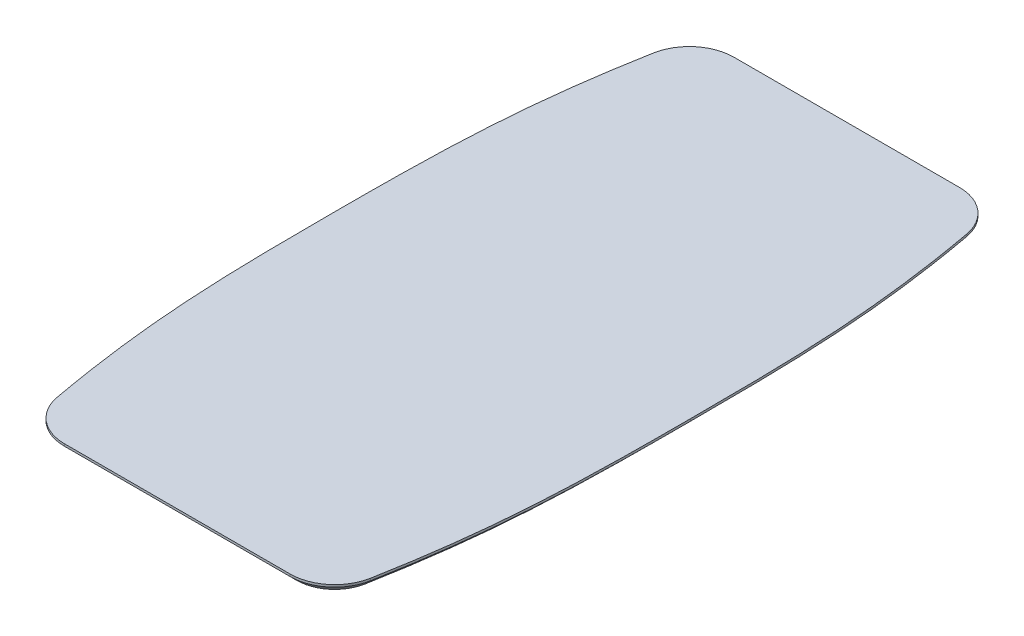
ISO-10303-21;
HEADER;
FILE_DESCRIPTION(('STEP AP214'),'2;1');
FILE_NAME('part.step','',(''),(''),'','','');
FILE_SCHEMA(('AUTOMOTIVE_DESIGN { 1 0 10303 214 1 1 1 1 }'));
ENDSEC;
DATA;
#1=APPLICATION_CONTEXT('core data for automotive mechanical design processes');
#2=APPLICATION_PROTOCOL_DEFINITION('international standard','automotive_design',2000,#1);
#3=PRODUCT_CONTEXT('',#1,'mechanical');
#4=PRODUCT('Part','Part','',(#3));
#5=PRODUCT_RELATED_PRODUCT_CATEGORY('part','',(#4));
#6=PRODUCT_DEFINITION_FORMATION('','',#4);
#7=PRODUCT_DEFINITION_CONTEXT('part definition',#1,'design');
#8=PRODUCT_DEFINITION('design','',#6,#7);
#9=PRODUCT_DEFINITION_SHAPE('','',#8);
#10=(LENGTH_UNIT() NAMED_UNIT(*) SI_UNIT(.MILLI.,.METRE.));
#11=(NAMED_UNIT(*) PLANE_ANGLE_UNIT() SI_UNIT($,.RADIAN.));
#12=(NAMED_UNIT(*) SI_UNIT($,.STERADIAN.) SOLID_ANGLE_UNIT());
#13=UNCERTAINTY_MEASURE_WITH_UNIT(LENGTH_MEASURE(1.E-05),#10,'distance_accuracy_value','');
#14=(GEOMETRIC_REPRESENTATION_CONTEXT(3) GLOBAL_UNCERTAINTY_ASSIGNED_CONTEXT((#13)) GLOBAL_UNIT_ASSIGNED_CONTEXT((#10,
#11,#12)) REPRESENTATION_CONTEXT('',''));
#15=CARTESIAN_POINT('',(0.,0.,0.));
#16=DIRECTION('',(0.,0.,1.));
#17=DIRECTION('',(1.,0.,0.));
#18=AXIS2_PLACEMENT_3D('',#15,#16,#17);
#19=CARTESIAN_POINT('',(0.,-46.,0.));
#20=DIRECTION('',(0.,-1.,0.));
#21=DIRECTION('',(0.,0.,-1.));
#22=AXIS2_PLACEMENT_3D('',#19,#20,#21);
#23=PLANE('',#22);
#24=CARTESIAN_POINT('',(-50.5420977277823,-46.,-130.));
#25=DIRECTION('',(0.,-1.,0.));
#26=DIRECTION('',(0.,0.,-1.));
#27=AXIS2_PLACEMENT_3D('',#24,#25,#26);
#28=CIRCLE('',#27,20.);
#29=CARTESIAN_POINT('',(-50.5420977277823,-46.,-150.));
#30=VERTEX_POINT('',#29);
#31=CARTESIAN_POINT('',(-70.2130925848617,-46.,-133.612749829805));
#32=VERTEX_POINT('',#31);
#33=EDGE_CURVE('E35',#30,#32,#28,.F.);
#34=ORIENTED_EDGE('',*,*,#33,.T.);
#35=CARTESIAN_POINT('',(-67.,-46.,-150.));
#36=CARTESIAN_POINT('',(-79.2126887020527,-46.,-91.256062145386));
#37=CARTESIAN_POINT('',(-79.9999999999998,-46.,-53.3333333333333));
#38=CARTESIAN_POINT('',(-80.,-46.,0.));
#39=B_SPLINE_CURVE_WITH_KNOTS('',3,(#35,#36,#37,#38),.UNSPECIFIED.,.F.,.F.,(4,4),(0.,1.),.UNSPECIFIED.);
#40=CARTESIAN_POINT('',(-80.,-46.,0.));
#41=VERTEX_POINT('',#40);
#42=EDGE_CURVE('E630',#32,#41,#39,.T.);
#43=ORIENTED_EDGE('',*,*,#42,.T.);
#44=CARTESIAN_POINT('',(-80.,-46.,0.));
#45=CARTESIAN_POINT('',(-79.9999999999998,-46.,53.3333333333333));
#46=CARTESIAN_POINT('',(-79.2126887020527,-46.,91.256062145386));
#47=CARTESIAN_POINT('',(-67.,-46.,150.));
#48=B_SPLINE_CURVE_WITH_KNOTS('',3,(#44,#45,#46,#47),.UNSPECIFIED.,.F.,.F.,(4,4),(0.,1.),.UNSPECIFIED.);
#49=CARTESIAN_POINT('',(-70.2130925848617,-46.,133.612749829805));
#50=VERTEX_POINT('',#49);
#51=EDGE_CURVE('E646',#41,#50,#48,.T.);
#52=ORIENTED_EDGE('',*,*,#51,.T.);
#53=CARTESIAN_POINT('',(-50.5420977277822,-46.,130.));
#54=DIRECTION('',(0.,-1.,0.));
#55=DIRECTION('',(0.,0.,-1.));
#56=AXIS2_PLACEMENT_3D('',#53,#54,#55);
#57=CIRCLE('',#56,20.);
#58=CARTESIAN_POINT('',(-50.5420977277822,-46.,150.));
#59=VERTEX_POINT('',#58);
#60=EDGE_CURVE('E40',#50,#59,#57,.F.);
#61=ORIENTED_EDGE('',*,*,#60,.T.);
#62=DIRECTION('',(1.,0.,0.));
#63=VECTOR('',#62,1.);
#64=CARTESIAN_POINT('',(-67.,-46.,150.));
#65=LINE('',#64,#63);
#66=CARTESIAN_POINT('',(50.5420977277822,-46.,150.));
#67=VERTEX_POINT('',#66);
#68=EDGE_CURVE('E213',#59,#67,#65,.T.);
#69=ORIENTED_EDGE('',*,*,#68,.T.);
#70=CARTESIAN_POINT('',(50.5420977277822,-46.,130.));
#71=DIRECTION('',(0.,-1.,0.));
#72=DIRECTION('',(0.,0.,-1.));
#73=AXIS2_PLACEMENT_3D('',#70,#71,#72);
#74=CIRCLE('',#73,20.);
#75=CARTESIAN_POINT('',(70.2130925848617,-46.,133.612749829805));
#76=VERTEX_POINT('',#75);
#77=EDGE_CURVE('E11',#67,#76,#74,.F.);
#78=ORIENTED_EDGE('',*,*,#77,.T.);
#79=CARTESIAN_POINT('',(67.,-46.,150.));
#80=CARTESIAN_POINT('',(79.2126887020527,-46.,91.2560621453859));
#81=CARTESIAN_POINT('',(79.9999999999998,-46.,53.3333333333333));
#82=CARTESIAN_POINT('',(80.,-46.,0.));
#83=B_SPLINE_CURVE_WITH_KNOTS('',3,(#79,#80,#81,#82),.UNSPECIFIED.,.F.,.F.,(4,4),(0.,1.),.UNSPECIFIED.);
#84=CARTESIAN_POINT('',(80.,-46.,0.));
#85=VERTEX_POINT('',#84);
#86=EDGE_CURVE('E54',#76,#85,#83,.T.);
#87=ORIENTED_EDGE('',*,*,#86,.T.);
#88=CARTESIAN_POINT('',(80.,-46.,0.));
#89=CARTESIAN_POINT('',(79.9999999999998,-46.,-53.3333333333334));
#90=CARTESIAN_POINT('',(79.2126887020527,-46.,-91.2560621453859));
#91=CARTESIAN_POINT('',(67.,-46.,-150.));
#92=B_SPLINE_CURVE_WITH_KNOTS('',3,(#88,#89,#90,#91),.UNSPECIFIED.,.F.,.F.,(4,4),(0.,1.),.UNSPECIFIED.);
#93=CARTESIAN_POINT('',(70.2130925848617,-46.,-133.612749829805));
#94=VERTEX_POINT('',#93);
#95=EDGE_CURVE('E538',#85,#94,#92,.T.);
#96=ORIENTED_EDGE('',*,*,#95,.T.);
#97=CARTESIAN_POINT('',(50.5420977277822,-46.,-130.));
#98=DIRECTION('',(0.,-1.,0.));
#99=DIRECTION('',(0.,0.,-1.));
#100=AXIS2_PLACEMENT_3D('',#97,#98,#99);
#101=CIRCLE('',#100,20.);
#102=CARTESIAN_POINT('',(50.5420977277822,-46.,-150.));
#103=VERTEX_POINT('',#102);
#104=EDGE_CURVE('E534',#94,#103,#101,.F.);
#105=ORIENTED_EDGE('',*,*,#104,.T.);
#106=DIRECTION('',(-1.,0.,0.));
#107=VECTOR('',#106,1.);
#108=CARTESIAN_POINT('',(-67.,-46.,-150.));
#109=LINE('',#108,#107);
#110=EDGE_CURVE('E531',#103,#30,#109,.T.);
#111=ORIENTED_EDGE('',*,*,#110,.T.);
#112=EDGE_LOOP('',(#34,#43,#52,#61,#69,#78,#87,#96,#105,#111));
#113=FACE_BOUND('',#112,.T.);
#114=ADVANCED_FACE('F32',(#113),#23,.F.);
#115=CARTESIAN_POINT('',(-67.,-50.,-150.));
#116=CARTESIAN_POINT('',(-79.2126887020527,-50.,-91.256062145386));
#117=CARTESIAN_POINT('',(-79.9999999999998,-50.,-53.3333333333333));
#118=CARTESIAN_POINT('',(-80.,-50.,0.));
#119=B_SPLINE_CURVE_WITH_KNOTS('',3,(#115,#116,#117,#118),.UNSPECIFIED.,.F.,.F.,(4,4),(0.,1.),.UNSPECIFIED.);
#120=DIRECTION('',(0.,1.,0.));
#121=VECTOR('',#120,1.);
#122=SURFACE_OF_LINEAR_EXTRUSION('',#119,#121);
#123=ORIENTED_EDGE('',*,*,#42,.F.);
#124=DIRECTION('',(0.,1.,0.));
#125=VECTOR('',#124,1.);
#126=CARTESIAN_POINT('',(-70.2130925848617,0.,-133.612749829805));
#127=LINE('',#126,#125);
#128=CARTESIAN_POINT('',(-70.2130925848617,-47.,-133.612749829805));
#129=VERTEX_POINT('',#128);
#130=EDGE_CURVE('E192',#32,#129,#127,.F.);
#131=ORIENTED_EDGE('',*,*,#130,.T.);
#132=CARTESIAN_POINT('',(-70.2130925848605,-47.,-133.612749829812));
#133=CARTESIAN_POINT('',(-79.3567051959867,-47.,-83.8268623142315));
#134=CARTESIAN_POINT('',(-79.9999999999998,-47.,-48.2092647372321));
#135=CARTESIAN_POINT('',(-80.,-47.,0.));
#136=B_SPLINE_CURVE_WITH_KNOTS('',3,(#132,#133,#134,#135),.UNSPECIFIED.,.F.,.F.,(4,4),
(0.096076286176898,1.),.UNSPECIFIED.);
#137=CARTESIAN_POINT('',(-80.,-46.9999999999923,0.));
#138=VERTEX_POINT('',#137);
#139=EDGE_CURVE('E373',#129,#138,#136,.T.);
#140=ORIENTED_EDGE('',*,*,#139,.T.);
#141=DIRECTION('',(0.,1.,0.));
#142=VECTOR('',#141,1.);
#143=CARTESIAN_POINT('',(-80.,-50.,0.));
#144=LINE('',#143,#142);
#145=EDGE_CURVE('E176',#138,#41,#144,.T.);
#146=ORIENTED_EDGE('',*,*,#145,.T.);
#147=EDGE_LOOP('',(#123,#131,#140,#146));
#148=FACE_BOUND('',#147,.T.);
#149=ADVANCED_FACE('F278',(#148),#122,.T.);
#150=CARTESIAN_POINT('',(-67.,-50.,-150.));
#151=DIRECTION('',(0.,0.,-1.));
#152=DIRECTION('',(-1.,0.,0.));
#153=AXIS2_PLACEMENT_3D('',#150,#151,#152);
#154=PLANE('',#153);
#155=ORIENTED_EDGE('',*,*,#110,.F.);
#156=DIRECTION('',(0.,1.,0.));
#157=VECTOR('',#156,1.);
#158=CARTESIAN_POINT('',(50.5420977277822,-50.,-150.));
#159=LINE('',#158,#157);
#160=CARTESIAN_POINT('',(50.5420977277822,-47.,-150.));
#161=VERTEX_POINT('',#160);
#162=EDGE_CURVE('E219',#103,#161,#159,.F.);
#163=ORIENTED_EDGE('',*,*,#162,.T.);
#164=DIRECTION('',(-1.,0.,0.));
#165=VECTOR('',#164,1.);
#166=CARTESIAN_POINT('',(-50.5420977277823,-47.,-150.));
#167=LINE('',#166,#165);
#168=CARTESIAN_POINT('',(-50.5420977277823,-47.,-150.));
#169=VERTEX_POINT('',#168);
#170=EDGE_CURVE('E357',#161,#169,#167,.T.);
#171=ORIENTED_EDGE('',*,*,#170,.T.);
#172=DIRECTION('',(0.,1.,0.));
#173=VECTOR('',#172,1.);
#174=CARTESIAN_POINT('',(-50.5420977277823,-50.,-150.));
#175=LINE('',#174,#173);
#176=EDGE_CURVE('E212',#169,#30,#175,.T.);
#177=ORIENTED_EDGE('',*,*,#176,.T.);
#178=EDGE_LOOP('',(#155,#163,#171,#177));
#179=FACE_BOUND('',#178,.T.);
#180=ADVANCED_FACE('F307',(#179),#154,.T.);
#181=CARTESIAN_POINT('',(80.,-50.,0.));
#182=CARTESIAN_POINT('',(79.9999999999998,-50.,-53.3333333333334));
#183=CARTESIAN_POINT('',(79.2126887020527,-50.,-91.2560621453859));
#184=CARTESIAN_POINT('',(67.,-50.,-150.));
#185=B_SPLINE_CURVE_WITH_KNOTS('',3,(#181,#182,#183,#184),.UNSPECIFIED.,.F.,.F.,(4,4),(0.,1.),.UNSPECIFIED.);
#186=DIRECTION('',(0.,1.,0.));
#187=VECTOR('',#186,1.);
#188=SURFACE_OF_LINEAR_EXTRUSION('',#185,#187);
#189=ORIENTED_EDGE('',*,*,#95,.F.);
#190=DIRECTION('',(0.,1.,0.));
#191=VECTOR('',#190,1.);
#192=CARTESIAN_POINT('',(80.,-50.,0.));
#193=LINE('',#192,#191);
#194=CARTESIAN_POINT('',(80.,-47.,0.));
#195=VERTEX_POINT('',#194);
#196=EDGE_CURVE('E220',#195,#85,#193,.T.);
#197=ORIENTED_EDGE('',*,*,#196,.F.);
#198=CARTESIAN_POINT('',(80.,-47.,0.));
#199=CARTESIAN_POINT('',(79.9999999999998,-47.,-48.2092647372321));
#200=CARTESIAN_POINT('',(79.3567051959867,-47.,-83.8268623142315));
#201=CARTESIAN_POINT('',(70.2130925848604,-47.,-133.612749829812));
#202=B_SPLINE_CURVE_WITH_KNOTS('',3,(#198,#199,#200,#201),.UNSPECIFIED.,.F.,.F.,(4,4),(0.,
0.903923713823101),.UNSPECIFIED.);
#203=CARTESIAN_POINT('',(70.2130925848617,-47.,-133.612749829805));
#204=VERTEX_POINT('',#203);
#205=EDGE_CURVE('E351',#195,#204,#202,.T.);
#206=ORIENTED_EDGE('',*,*,#205,.T.);
#207=DIRECTION('',(0.,1.,0.));
#208=VECTOR('',#207,1.);
#209=CARTESIAN_POINT('',(70.2130925848617,-50.,-133.612749829805));
#210=LINE('',#209,#208);
#211=EDGE_CURVE('E186',#204,#94,#210,.T.);
#212=ORIENTED_EDGE('',*,*,#211,.T.);
#213=EDGE_LOOP('',(#189,#197,#206,#212));
#214=FACE_BOUND('',#213,.T.);
#215=ADVANCED_FACE('F253',(#214),#188,.T.);
#216=CARTESIAN_POINT('',(67.,-50.,150.));
#217=CARTESIAN_POINT('',(79.2126887020527,-50.,91.2560621453859));
#218=CARTESIAN_POINT('',(79.9999999999998,-50.,53.3333333333333));
#219=CARTESIAN_POINT('',(80.,-50.,0.));
#220=B_SPLINE_CURVE_WITH_KNOTS('',3,(#216,#217,#218,#219),.UNSPECIFIED.,.F.,.F.,(4,4),(0.,1.),.UNSPECIFIED.);
#221=DIRECTION('',(0.,1.,0.));
#222=VECTOR('',#221,1.);
#223=SURFACE_OF_LINEAR_EXTRUSION('',#220,#222);
#224=ORIENTED_EDGE('',*,*,#86,.F.);
#225=DIRECTION('',(0.,1.,0.));
#226=VECTOR('',#225,1.);
#227=CARTESIAN_POINT('',(70.2130925848617,0.,133.612749829805));
#228=LINE('',#227,#226);
#229=CARTESIAN_POINT('',(70.2130925848617,-47.,133.612749829805));
#230=VERTEX_POINT('',#229);
#231=EDGE_CURVE('E179',#76,#230,#228,.F.);
#232=ORIENTED_EDGE('',*,*,#231,.T.);
#233=CARTESIAN_POINT('',(70.2130925848604,-47.,133.612749829812));
#234=CARTESIAN_POINT('',(79.3567051959867,-47.,83.8268623142315));
#235=CARTESIAN_POINT('',(79.9999999999998,-47.,48.2092647372321));
#236=CARTESIAN_POINT('',(80.,-47.,0.));
#237=B_SPLINE_CURVE_WITH_KNOTS('',3,(#233,#234,#235,#236),.UNSPECIFIED.,.F.,.F.,(4,4),
(0.0960762861768977,1.),.UNSPECIFIED.);
#238=EDGE_CURVE('E236',#230,#195,#237,.T.);
#239=ORIENTED_EDGE('',*,*,#238,.T.);
#240=ORIENTED_EDGE('',*,*,#196,.T.);
#241=EDGE_LOOP('',(#224,#232,#239,#240));
#242=FACE_BOUND('',#241,.T.);
#243=ADVANCED_FACE('F242',(#242),#223,.T.);
#244=CARTESIAN_POINT('',(-67.,-50.,150.));
#245=DIRECTION('',(0.,0.,1.));
#246=DIRECTION('',(1.,0.,0.));
#247=AXIS2_PLACEMENT_3D('',#244,#245,#246);
#248=PLANE('',#247);
#249=ORIENTED_EDGE('',*,*,#68,.F.);
#250=DIRECTION('',(0.,1.,0.));
#251=VECTOR('',#250,1.);
#252=CARTESIAN_POINT('',(-50.5420977277822,-50.,150.));
#253=LINE('',#252,#251);
#254=CARTESIAN_POINT('',(-50.5420977277822,-47.,150.));
#255=VERTEX_POINT('',#254);
#256=EDGE_CURVE('E189',#59,#255,#253,.F.);
#257=ORIENTED_EDGE('',*,*,#256,.T.);
#258=DIRECTION('',(1.,0.,0.));
#259=VECTOR('',#258,1.);
#260=CARTESIAN_POINT('',(50.5420977277822,-47.,150.));
#261=LINE('',#260,#259);
#262=CARTESIAN_POINT('',(50.5420977277822,-47.,150.));
#263=VERTEX_POINT('',#262);
#264=EDGE_CURVE('E167',#255,#263,#261,.T.);
#265=ORIENTED_EDGE('',*,*,#264,.T.);
#266=DIRECTION('',(0.,1.,0.));
#267=VECTOR('',#266,1.);
#268=CARTESIAN_POINT('',(50.5420977277822,-50.,150.));
#269=LINE('',#268,#267);
#270=EDGE_CURVE('E185',#263,#67,#269,.T.);
#271=ORIENTED_EDGE('',*,*,#270,.T.);
#272=EDGE_LOOP('',(#249,#257,#265,#271));
#273=FACE_BOUND('',#272,.T.);
#274=ADVANCED_FACE('F252',(#273),#248,.T.);
#275=CARTESIAN_POINT('',(-80.,-50.,0.));
#276=CARTESIAN_POINT('',(-79.9999999999998,-50.,53.3333333333333));
#277=CARTESIAN_POINT('',(-79.2126887020527,-50.,91.256062145386));
#278=CARTESIAN_POINT('',(-67.,-50.,150.));
#279=B_SPLINE_CURVE_WITH_KNOTS('',3,(#275,#276,#277,#278),.UNSPECIFIED.,.F.,.F.,(4,4),(0.,1.),.UNSPECIFIED.);
#280=DIRECTION('',(0.,1.,0.));
#281=VECTOR('',#280,1.);
#282=SURFACE_OF_LINEAR_EXTRUSION('',#279,#281);
#283=ORIENTED_EDGE('',*,*,#51,.F.);
#284=ORIENTED_EDGE('',*,*,#145,.F.);
#285=CARTESIAN_POINT('',(-80.,-47.,0.));
#286=CARTESIAN_POINT('',(-79.9999999999998,-47.,48.2092647372321));
#287=CARTESIAN_POINT('',(-79.3567051959867,-47.,83.8268623142315));
#288=CARTESIAN_POINT('',(-70.2130925848604,-47.,133.612749829812));
#289=B_SPLINE_CURVE_WITH_KNOTS('',3,(#285,#286,#287,#288),.UNSPECIFIED.,.F.,.F.,(4,4),(0.,
0.903923713823101),.UNSPECIFIED.);
#290=CARTESIAN_POINT('',(-70.2130925848617,-47.,133.612749829805));
#291=VERTEX_POINT('',#290);
#292=EDGE_CURVE('E146',#138,#291,#289,.T.);
#293=ORIENTED_EDGE('',*,*,#292,.T.);
#294=DIRECTION('',(0.,1.,0.));
#295=VECTOR('',#294,1.);
#296=CARTESIAN_POINT('',(-70.2130925848617,-50.,133.612749829805));
#297=LINE('',#296,#295);
#298=EDGE_CURVE('E174',#291,#50,#297,.T.);
#299=ORIENTED_EDGE('',*,*,#298,.T.);
#300=EDGE_LOOP('',(#283,#284,#293,#299));
#301=FACE_BOUND('',#300,.T.);
#302=ADVANCED_FACE('F173',(#301),#282,.T.);
#303=CARTESIAN_POINT('',(-78.0797582632697,-50.,-72.9710233045197));
#304=DIRECTION('',(0.,1.,0.));
#305=DIRECTION('',(0.,0.,1.));
#306=AXIS2_PLACEMENT_3D('',#303,#304,#305);
#307=PLANE('',#306);
#308=CARTESIAN_POINT('',(-50.5420977277822,-50.,130.));
#309=DIRECTION('',(0.,1.,0.));
#310=DIRECTION('',(0.,0.,1.));
#311=AXIS2_PLACEMENT_3D('',#308,#309,#310);
#312=CIRCLE('',#311,17.);
#313=CARTESIAN_POINT('',(-50.5420977277822,-50.,147.));
#314=VERTEX_POINT('',#313);
#315=CARTESIAN_POINT('',(-67.2624433562985,-50.,133.070837355341));
#316=VERTEX_POINT('',#315);
#317=EDGE_CURVE('E335',#314,#316,#312,.F.);
#318=ORIENTED_EDGE('',*,*,#317,.T.);
#319=CARTESIAN_POINT('',(-77.,-50.,0.));
#320=CARTESIAN_POINT('',(-76.9999246350399,-50.,5.56972747860356));
#321=CARTESIAN_POINT('',(-76.9917468029326,-50.,11.1393663040661));
#322=CARTESIAN_POINT('',(-76.9271541248784,-50.,22.2781161728625));
#323=CARTESIAN_POINT('',(-76.8706135401708,-50.,27.8473427625315));
#324=CARTESIAN_POINT('',(-76.7207698856601,-50.,36.2001203238439));
#325=CARTESIAN_POINT('',(-76.6599001428068,-50.,38.9843474277254));
#326=CARTESIAN_POINT('',(-76.5113736464877,-50.,44.5525096451225));
#327=CARTESIAN_POINT('',(-76.4236809388062,-50.,47.3363445453702));
#328=CARTESIAN_POINT('',(-76.1133047678833,-50.,55.684240808743));
#329=CARTESIAN_POINT('',(-75.8427648368739,-50.,61.2454692329679));
#330=CARTESIAN_POINT('',(-75.3181974953393,-50.,69.579792178243));
#331=CARTESIAN_POINT('',(-75.1236091511747,-50.,72.356649725108));
#332=CARTESIAN_POINT('',(-74.6924427012141,-50.,77.9077046778532));
#333=CARTESIAN_POINT('',(-74.4558430657217,-50.,80.6819970368138));
#334=CARTESIAN_POINT('',(-73.9391393537637,-50.,86.2274403840528));
#335=CARTESIAN_POINT('',(-73.6589302655495,-50.,88.9995367556694));
#336=CARTESIAN_POINT('',(-73.0549465396082,-50.,94.5366287214407));
#337=CARTESIAN_POINT('',(-72.7311513884567,-50.,97.3020705102008));
#338=CARTESIAN_POINT('',(-72.0405398911324,-50.,102.8267052179));
#339=CARTESIAN_POINT('',(-71.6737334229871,-50.,105.58592038572));
#340=CARTESIAN_POINT('',(-70.898453573566,-50.,111.098338898627));
#341=CARTESIAN_POINT('',(-70.4899987544202,-50.,113.851544921792));
#342=CARTESIAN_POINT('',(-69.2049618991668,-50.,122.102553285674));
#343=CARTESIAN_POINT('',(-68.2687523596724,-50.,127.591752397136));
#344=CARTESIAN_POINT('',(-67.2624433562985,-50.,133.070837355341));
#345=B_SPLINE_CURVE_WITH_KNOTS('',3,(#319,#320,#321,#322,#323,#324,#325,#326,#327,#328,#329,
#330,#331,#332,#333,#334,#335,#336,#337,#338,#339,#340,#341,#342,#343,#344),.UNSPECIFIED.,.F.,
.F.,(4,2,2,2,2,2,2,2,2,2,2,2,4),(0.,0.0166999041855329,0.0333998083710659,0.0417497604638323,
0.0500997125565988,0.0667996167421317,0.0751495688348982,0.0834995209276647,0.0918494730204311,
0.100199425113198,0.108549377205964,0.116899329298731,0.133599233484263),.UNSPECIFIED.);
#346=CARTESIAN_POINT('',(-77.,-50.,0.));
#347=VERTEX_POINT('',#346);
#348=EDGE_CURVE('E149',#316,#347,#345,.F.);
#349=ORIENTED_EDGE('',*,*,#348,.T.);
#350=CARTESIAN_POINT('',(-67.2624433562985,-50.,-133.070837355341));
#351=CARTESIAN_POINT('',(-68.2687504814547,-50.,-127.591762405173));
#352=CARTESIAN_POINT('',(-69.2049697545193,-50.,-122.102512927923));
#353=CARTESIAN_POINT('',(-70.490032217434,-50.,-113.851325016208));
#354=CARTESIAN_POINT('',(-70.8984973737365,-50.,-111.098041795806));
#355=CARTESIAN_POINT('',(-71.6738000467543,-50.,-105.585432345322));
#356=CARTESIAN_POINT('',(-72.0406189938867,-50.,-102.826103419649));
#357=CARTESIAN_POINT('',(-72.731255931787,-50.,-97.3012031968644));
#358=CARTESIAN_POINT('',(-73.0550550990931,-50.,-94.5356971611394));
#359=CARTESIAN_POINT('',(-73.6590813632625,-50.,-88.9980878350079));
#360=CARTESIAN_POINT('',(-73.9392512296184,-50.,-86.2263359587117));
#361=CARTESIAN_POINT('',(-74.7142573012216,-50.,-77.9084133433172));
#362=CARTESIAN_POINT('',(-75.143376394291,-50.,-72.3574088378304));
#363=CARTESIAN_POINT('',(-75.8427831492043,-50.,-61.2451183262079));
#364=CARTESIAN_POINT('',(-76.113322818658,-50.,-55.683880285069));
#365=CARTESIAN_POINT('',(-76.4237034685099,-50.,-47.335676165444));
#366=CARTESIAN_POINT('',(-76.5113968389664,-50.,-44.5517282032462));
#367=CARTESIAN_POINT('',(-76.6599130906574,-50.,-38.9837739985521));
#368=CARTESIAN_POINT('',(-76.7207808428361,-50.,-36.1995717086352));
#369=CARTESIAN_POINT('',(-76.8706184812856,-50.,-27.846943291124));
#370=CARTESIAN_POINT('',(-76.9271565002719,-50.,-22.2778172785591));
#371=CARTESIAN_POINT('',(-76.9917469596549,-50.,-11.1392287268974));
#372=CARTESIAN_POINT('',(-76.99992464515,-50.,-5.56966039801091));
#373=CARTESIAN_POINT('',(-77.,-50.,0.));
#374=B_SPLINE_CURVE_WITH_KNOTS('',3,(#350,#351,#352,#353,#354,#355,#356,#357,#358,#359,#360,
#361,#362,#363,#364,#365,#366,#367,#368,#369,#370,#371,#372,#373),.UNSPECIFIED.,.F.,.F.,(4,2,2,
2,2,2,2,2,2,2,2,4),(0.,0.0167079051064856,0.0250618576597284,0.0334158102129711,
0.0417697627662139,0.0501237153194567,0.0668316204259423,0.0835395255324279,0.0918934780856706,
0.100247430638913,0.116955335745399,0.133663240851885),.UNSPECIFIED.);
#375=CARTESIAN_POINT('',(-67.2624433562985,-50.,-133.070837355341));
#376=VERTEX_POINT('',#375);
#377=EDGE_CURVE('E178',#347,#376,#374,.F.);
#378=ORIENTED_EDGE('',*,*,#377,.T.);
#379=CARTESIAN_POINT('',(-50.5420977277823,-50.,-130.));
#380=DIRECTION('',(0.,1.,0.));
#381=DIRECTION('',(0.,0.,1.));
#382=AXIS2_PLACEMENT_3D('',#379,#380,#381);
#383=CIRCLE('',#382,17.);
#384=CARTESIAN_POINT('',(-50.5420977277823,-50.,-147.));
#385=VERTEX_POINT('',#384);
#386=EDGE_CURVE('E297',#376,#385,#383,.F.);
#387=ORIENTED_EDGE('',*,*,#386,.T.);
#388=DIRECTION('',(1.,0.,0.));
#389=VECTOR('',#388,1.);
#390=CARTESIAN_POINT('',(50.5420977277822,-50.,-147.));
#391=LINE('',#390,#389);
#392=CARTESIAN_POINT('',(50.5420977277822,-50.,-147.));
#393=VERTEX_POINT('',#392);
#394=EDGE_CURVE('E514',#385,#393,#391,.T.);
#395=ORIENTED_EDGE('',*,*,#394,.T.);
#396=CARTESIAN_POINT('',(50.5420977277822,-50.,-130.));
#397=DIRECTION('',(0.,1.,0.));
#398=DIRECTION('',(0.,0.,1.));
#399=AXIS2_PLACEMENT_3D('',#396,#397,#398);
#400=CIRCLE('',#399,17.);
#401=CARTESIAN_POINT('',(67.2624433562985,-50.,-133.070837355341));
#402=VERTEX_POINT('',#401);
#403=EDGE_CURVE('E513',#393,#402,#400,.F.);
#404=ORIENTED_EDGE('',*,*,#403,.T.);
#405=CARTESIAN_POINT('',(77.,-50.,0.));
#406=CARTESIAN_POINT('',(76.99992463504,-50.,-5.56972747860355));
#407=CARTESIAN_POINT('',(76.9917468029325,-50.,-11.1393663040662));
#408=CARTESIAN_POINT('',(76.9271541248784,-50.,-22.2781161728625));
#409=CARTESIAN_POINT('',(76.8706135401709,-50.,-27.8473427625315));
#410=CARTESIAN_POINT('',(76.7207698856601,-50.,-36.2001203238439));
#411=CARTESIAN_POINT('',(76.6599001428069,-50.,-38.9843474277254));
#412=CARTESIAN_POINT('',(76.5113736464877,-50.,-44.5525096451225));
#413=CARTESIAN_POINT('',(76.4236809388062,-50.,-47.3363445453702));
#414=CARTESIAN_POINT('',(76.1133047678832,-50.,-55.6842408087429));
#415=CARTESIAN_POINT('',(75.842764836874,-50.,-61.2454692329678));
#416=CARTESIAN_POINT('',(75.3181974953393,-50.,-69.579792178243));
#417=CARTESIAN_POINT('',(75.1236091511748,-50.,-72.356649725108));
#418=CARTESIAN_POINT('',(74.6924427012141,-50.,-77.9077046778533));
#419=CARTESIAN_POINT('',(74.4558430657217,-50.,-80.6819970368138));
#420=CARTESIAN_POINT('',(73.9391393537637,-50.,-86.2274403840528));
#421=CARTESIAN_POINT('',(73.6589302655495,-50.,-88.9995367556694));
#422=CARTESIAN_POINT('',(73.0549465396082,-50.,-94.5366287214407));
#423=CARTESIAN_POINT('',(72.7311513884567,-50.,-97.3020705102008));
#424=CARTESIAN_POINT('',(72.0405398911324,-50.,-102.8267052179));
#425=CARTESIAN_POINT('',(71.6737334229871,-50.,-105.58592038572));
#426=CARTESIAN_POINT('',(70.898453573566,-50.,-111.098338898627));
#427=CARTESIAN_POINT('',(70.4899987544202,-50.,-113.851544921792));
#428=CARTESIAN_POINT('',(69.2049618991668,-50.,-122.102553285674));
#429=CARTESIAN_POINT('',(68.2687523596724,-50.,-127.591752397136));
#430=CARTESIAN_POINT('',(67.2624433562985,-50.,-133.070837355341));
#431=B_SPLINE_CURVE_WITH_KNOTS('',3,(#405,#406,#407,#408,#409,#410,#411,#412,#413,#414,#415,
#416,#417,#418,#419,#420,#421,#422,#423,#424,#425,#426,#427,#428,#429,#430),.UNSPECIFIED.,.F.,
.F.,(4,2,2,2,2,2,2,2,2,2,2,2,4),(0.,0.0166999041855329,0.0333998083710659,0.0417497604638323,
0.0500997125565988,0.0667996167421317,0.0751495688348982,0.0834995209276647,0.0918494730204311,
0.100199425113198,0.108549377205964,0.116899329298731,0.133599233484263),.UNSPECIFIED.);
#432=CARTESIAN_POINT('',(77.,-50.,0.));
#433=VERTEX_POINT('',#432);
#434=EDGE_CURVE('E512',#402,#433,#431,.F.);
#435=ORIENTED_EDGE('',*,*,#434,.T.);
#436=CARTESIAN_POINT('',(67.2624433562985,-50.,133.070837355341));
#437=CARTESIAN_POINT('',(68.2687504814547,-50.,127.591762405173));
#438=CARTESIAN_POINT('',(69.2049697545193,-50.,122.102512927923));
#439=CARTESIAN_POINT('',(70.490032217434,-50.,113.851325016208));
#440=CARTESIAN_POINT('',(70.8984973737364,-50.,111.098041795806));
#441=CARTESIAN_POINT('',(71.6738000467543,-50.,105.585432345322));
#442=CARTESIAN_POINT('',(72.0406189938867,-50.,102.826103419649));
#443=CARTESIAN_POINT('',(72.7312559317871,-50.,97.3012031968645));
#444=CARTESIAN_POINT('',(73.0550550990932,-50.,94.5356971611395));
#445=CARTESIAN_POINT('',(73.6590813632624,-50.,88.998087835008));
#446=CARTESIAN_POINT('',(73.9392512296184,-50.,86.2263359587118));
#447=CARTESIAN_POINT('',(74.7142573012216,-50.,77.9084133433172));
#448=CARTESIAN_POINT('',(75.143376394291,-50.,72.3574088378304));
#449=CARTESIAN_POINT('',(75.8427831492042,-50.,61.245118326208));
#450=CARTESIAN_POINT('',(76.113322818658,-50.,55.6838802850691));
#451=CARTESIAN_POINT('',(76.4237034685099,-50.,47.335676165444));
#452=CARTESIAN_POINT('',(76.5113968389664,-50.,44.5517282032462));
#453=CARTESIAN_POINT('',(76.6599130906573,-50.,38.9837739985521));
#454=CARTESIAN_POINT('',(76.7207808428361,-50.,36.1995717086352));
#455=CARTESIAN_POINT('',(76.8706184812856,-50.,27.846943291124));
#456=CARTESIAN_POINT('',(76.9271565002719,-50.,22.2778172785591));
#457=CARTESIAN_POINT('',(76.9917469596549,-50.,11.1392287268974));
#458=CARTESIAN_POINT('',(76.99992464515,-50.,5.56966039801091));
#459=CARTESIAN_POINT('',(77.,-50.,0.));
#460=B_SPLINE_CURVE_WITH_KNOTS('',3,(#436,#437,#438,#439,#440,#441,#442,#443,#444,#445,#446,
#447,#448,#449,#450,#451,#452,#453,#454,#455,#456,#457,#458,#459),.UNSPECIFIED.,.F.,.F.,(4,2,2,
2,2,2,2,2,2,2,2,4),(0.,0.0167079051064856,0.0250618576597284,0.0334158102129712,
0.0417697627662139,0.0501237153194567,0.0668316204259423,0.0835395255324279,0.0918934780856707,
0.100247430638913,0.116955335745399,0.133663240851885),.UNSPECIFIED.);
#461=CARTESIAN_POINT('',(67.2624433562985,-50.,133.070837355341));
#462=VERTEX_POINT('',#461);
#463=EDGE_CURVE('E331',#433,#462,#460,.F.);
#464=ORIENTED_EDGE('',*,*,#463,.T.);
#465=CARTESIAN_POINT('',(50.5420977277822,-50.,130.));
#466=DIRECTION('',(0.,1.,0.));
#467=DIRECTION('',(0.,0.,1.));
#468=AXIS2_PLACEMENT_3D('',#465,#466,#467);
#469=CIRCLE('',#468,17.);
#470=CARTESIAN_POINT('',(50.5420977277822,-50.,147.));
#471=VERTEX_POINT('',#470);
#472=EDGE_CURVE('E323',#462,#471,#469,.F.);
#473=ORIENTED_EDGE('',*,*,#472,.T.);
#474=DIRECTION('',(-1.,0.,0.));
#475=VECTOR('',#474,1.);
#476=CARTESIAN_POINT('',(-50.5420977277822,-50.,147.));
#477=LINE('',#476,#475);
#478=EDGE_CURVE('E330',#471,#314,#477,.T.);
#479=ORIENTED_EDGE('',*,*,#478,.T.);
#480=EDGE_LOOP('',(#318,#349,#378,#387,#395,#404,#435,#464,#473,#479));
#481=FACE_BOUND('',#480,.T.);
#482=ADVANCED_FACE('F277',(#481),#307,.F.);
#483=CARTESIAN_POINT('',(-50.5420977277823,-25.,-130.));
#484=DIRECTION('',(0.,1.,0.));
#485=DIRECTION('',(0.,0.,1.));
#486=AXIS2_PLACEMENT_3D('',#483,#484,#485);
#487=CYLINDRICAL_SURFACE('',#486,20.);
#488=ORIENTED_EDGE('',*,*,#33,.F.);
#489=ORIENTED_EDGE('',*,*,#176,.F.);
#490=CARTESIAN_POINT('',(-50.5420977277823,-47.,-130.));
#491=DIRECTION('',(0.,1.,0.));
#492=DIRECTION('',(0.,0.,1.));
#493=AXIS2_PLACEMENT_3D('',#490,#491,#492);
#494=CIRCLE('',#493,20.);
#495=EDGE_CURVE('E363',#169,#129,#494,.T.);
#496=ORIENTED_EDGE('',*,*,#495,.T.);
#497=ORIENTED_EDGE('',*,*,#130,.F.);
#498=EDGE_LOOP('',(#488,#489,#496,#497));
#499=FACE_BOUND('',#498,.T.);
#500=ADVANCED_FACE('F306',(#499),#487,.T.);
#501=CARTESIAN_POINT('',(50.5420977277822,-25.,-130.));
#502=DIRECTION('',(0.,1.,0.));
#503=DIRECTION('',(0.,0.,1.));
#504=AXIS2_PLACEMENT_3D('',#501,#502,#503);
#505=CYLINDRICAL_SURFACE('',#504,20.);
#506=ORIENTED_EDGE('',*,*,#104,.F.);
#507=ORIENTED_EDGE('',*,*,#211,.F.);
#508=CARTESIAN_POINT('',(50.5420977277822,-47.,-130.));
#509=DIRECTION('',(0.,1.,0.));
#510=DIRECTION('',(0.,0.,1.));
#511=AXIS2_PLACEMENT_3D('',#508,#509,#510);
#512=CIRCLE('',#511,20.);
#513=EDGE_CURVE('E352',#204,#161,#512,.T.);
#514=ORIENTED_EDGE('',*,*,#513,.T.);
#515=ORIENTED_EDGE('',*,*,#162,.F.);
#516=EDGE_LOOP('',(#506,#507,#514,#515));
#517=FACE_BOUND('',#516,.T.);
#518=ADVANCED_FACE('F533',(#517),#505,.T.);
#519=CARTESIAN_POINT('',(-50.5420977277822,-25.,130.));
#520=DIRECTION('',(0.,1.,0.));
#521=DIRECTION('',(0.,0.,1.));
#522=AXIS2_PLACEMENT_3D('',#519,#520,#521);
#523=CYLINDRICAL_SURFACE('',#522,20.);
#524=ORIENTED_EDGE('',*,*,#60,.F.);
#525=ORIENTED_EDGE('',*,*,#298,.F.);
#526=CARTESIAN_POINT('',(-50.5420977277822,-47.,130.));
#527=DIRECTION('',(0.,1.,0.));
#528=DIRECTION('',(0.,0.,1.));
#529=AXIS2_PLACEMENT_3D('',#526,#527,#528);
#530=CIRCLE('',#529,20.);
#531=EDGE_CURVE('E159',#291,#255,#530,.T.);
#532=ORIENTED_EDGE('',*,*,#531,.T.);
#533=ORIENTED_EDGE('',*,*,#256,.F.);
#534=EDGE_LOOP('',(#524,#525,#532,#533));
#535=FACE_BOUND('',#534,.T.);
#536=ADVANCED_FACE('F182',(#535),#523,.T.);
#537=CARTESIAN_POINT('',(50.5420977277822,-25.,130.));
#538=DIRECTION('',(0.,1.,0.));
#539=DIRECTION('',(0.,0.,1.));
#540=AXIS2_PLACEMENT_3D('',#537,#538,#539);
#541=CYLINDRICAL_SURFACE('',#540,20.);
#542=ORIENTED_EDGE('',*,*,#77,.F.);
#543=ORIENTED_EDGE('',*,*,#270,.F.);
#544=CARTESIAN_POINT('',(50.5420977277822,-47.,130.));
#545=DIRECTION('',(0.,1.,0.));
#546=DIRECTION('',(0.,0.,1.));
#547=AXIS2_PLACEMENT_3D('',#544,#545,#546);
#548=CIRCLE('',#547,20.);
#549=EDGE_CURVE('E349',#263,#230,#548,.T.);
#550=ORIENTED_EDGE('',*,*,#549,.T.);
#551=ORIENTED_EDGE('',*,*,#231,.F.);
#552=EDGE_LOOP('',(#542,#543,#550,#551));
#553=FACE_BOUND('',#552,.T.);
#554=ADVANCED_FACE('F488',(#553),#541,.T.);
#555=CARTESIAN_POINT('',(80.,-47.,0.));
#556=CARTESIAN_POINT('',(79.9999235197906,-47.,-5.57281022824872));
#557=CARTESIAN_POINT('',(79.9917473287727,-47.,-11.1480076507233));
#558=CARTESIAN_POINT('',(79.927052633246,-47.,-22.3042825740966));
#559=CARTESIAN_POINT('',(79.8704112614887,-47.,-27.8855174854851));
#560=CARTESIAN_POINT('',(79.7201467828307,-47.,-36.2617649573162));
#561=CARTESIAN_POINT('',(79.6590900251072,-47.,-39.0547217006954));
#562=CARTESIAN_POINT('',(79.5100502744108,-47.,-44.6421270142495));
#563=CARTESIAN_POINT('',(79.4220305483072,-47.,-47.4364760992945));
#564=CARTESIAN_POINT('',(79.1103902570676,-47.,-55.8183975310373));
#565=CARTESIAN_POINT('',(78.8386184723932,-47.,-61.4056543373008));
#566=CARTESIAN_POINT('',(78.3113827585071,-47.,-69.7823872213968));
#567=CARTESIAN_POINT('',(78.1157686546911,-47.,-72.5739261822913));
#568=CARTESIAN_POINT('',(77.6822654259382,-47.,-78.1550663820539));
#569=CARTESIAN_POINT('',(77.4443544048689,-47.,-80.944759683108));
#570=CARTESIAN_POINT('',(76.9247505869473,-47.,-86.5213279787248));
#571=CARTESIAN_POINT('',(76.6429523601053,-47.,-89.3091517625249));
#572=CARTESIAN_POINT('',(76.0355453136617,-47.,-94.8776271895066));
#573=CARTESIAN_POINT('',(75.7099161982462,-47.,-97.6587261560405));
#574=CARTESIAN_POINT('',(75.0154382680602,-47.,-103.214290567388));
#575=CARTESIAN_POINT('',(74.6465997416154,-47.,-105.988777853094));
#576=CARTESIAN_POINT('',(73.8671126817237,-47.,-111.53111029795));
#577=CARTESIAN_POINT('',(73.4564832237386,-47.,-114.298958784659));
#578=CARTESIAN_POINT('',(72.1647920838032,-47.,-122.592689008236));
#579=CARTESIAN_POINT('',(71.2239778370641,-47.,-128.108749387778));
#580=CARTESIAN_POINT('',(70.2130925848604,-47.,-133.612749829812));
#581=CARTESIAN_POINT('',(77.,-50.,0.));
#582=CARTESIAN_POINT('',(76.99992463504,-50.,-5.56972747860355));
#583=CARTESIAN_POINT('',(76.9917468029325,-50.,-11.1393663040662));
#584=CARTESIAN_POINT('',(76.9271541248784,-50.,-22.2781161728625));
#585=CARTESIAN_POINT('',(76.8706135401709,-50.,-27.8473427625315));
#586=CARTESIAN_POINT('',(76.7207698856601,-50.,-36.2001203238439));
#587=CARTESIAN_POINT('',(76.6599001428069,-50.,-38.9843474277254));
#588=CARTESIAN_POINT('',(76.5113736464877,-50.,-44.5525096451225));
#589=CARTESIAN_POINT('',(76.4236809388062,-50.,-47.3363445453702));
#590=CARTESIAN_POINT('',(76.1133047678832,-50.,-55.6842408087429));
#591=CARTESIAN_POINT('',(75.842764836874,-50.,-61.2454692329678));
#592=CARTESIAN_POINT('',(75.3181974953393,-50.,-69.579792178243));
#593=CARTESIAN_POINT('',(75.1236091511748,-50.,-72.356649725108));
#594=CARTESIAN_POINT('',(74.6924427012141,-50.,-77.9077046778533));
#595=CARTESIAN_POINT('',(74.4558430657217,-50.,-80.6819970368138));
#596=CARTESIAN_POINT('',(73.9391393537637,-50.,-86.2274403840528));
#597=CARTESIAN_POINT('',(73.6589302655495,-50.,-88.9995367556694));
#598=CARTESIAN_POINT('',(73.0549465396082,-50.,-94.5366287214407));
#599=CARTESIAN_POINT('',(72.7311513884567,-50.,-97.3020705102008));
#600=CARTESIAN_POINT('',(72.0405398911324,-50.,-102.8267052179));
#601=CARTESIAN_POINT('',(71.6737334229871,-50.,-105.58592038572));
#602=CARTESIAN_POINT('',(70.898453573566,-50.,-111.098338898627));
#603=CARTESIAN_POINT('',(70.4899987544202,-50.,-113.851544921792));
#604=CARTESIAN_POINT('',(69.2049618991668,-50.,-122.102553285674));
#605=CARTESIAN_POINT('',(68.2687523596724,-50.,-127.591752397136));
#606=CARTESIAN_POINT('',(67.2624433562985,-50.,-133.070837355341));
#607=B_SPLINE_SURFACE_WITH_KNOTS('',1,3,((#555,#556,#557,#558,#559,#560,#561,#562,#563,#564,
#565,#566,#567,#568,#569,#570,#571,#572,#573,#574,#575,#576,#577,#578,#579,#580),(#581,#582,
#583,#584,#585,#586,#587,#588,#589,#590,#591,#592,#593,#594,#595,#596,#597,#598,#599,#600,#601,
#602,#603,#604,#605,#606)),.UNSPECIFIED.,.F.,.F.,.F.,(2,2),(4,2,2,2,2,2,2,2,2,2,2,2,4),(0.,1.),
(0.,0.0166999041855329,0.0333998083710659,0.0417497604638323,0.0500997125565988,
0.0667996167421317,0.0751495688348982,0.0834995209276647,0.0918494730204311,0.100199425113198,
0.108549377205964,0.116899329298731,0.133599233484263),.UNSPECIFIED.);
#608=CARTESIAN_POINT('',(77.,-50.,0.));
#609=CARTESIAN_POINT('',(80.,-47.,0.));
#610=B_SPLINE_CURVE_WITH_KNOTS('',1,(#608,#609),.UNSPECIFIED.,.F.,.F.,(2,2),(0.,1.),.UNSPECIFIED.);
#611=EDGE_CURVE('E397',#433,#195,#610,.T.);
#612=CARTESIAN_POINT('',(67.2624433562985,-50.,-133.070837355341));
#613=CARTESIAN_POINT('',(70.2130925848604,-47.,-133.612749829812));
#614=B_SPLINE_CURVE_WITH_KNOTS('',1,(#612,#613),.UNSPECIFIED.,.F.,.F.,(2,2),(0.,1.),.UNSPECIFIED.);
#615=EDGE_CURVE('E402',#204,#402,#614,.F.);
#616=ORIENTED_EDGE('',*,*,#611,.F.);
#617=ORIENTED_EDGE('',*,*,#434,.F.);
#618=ORIENTED_EDGE('',*,*,#615,.F.);
#619=ORIENTED_EDGE('',*,*,#205,.F.);
#620=EDGE_LOOP('',(#616,#617,#618,#619));
#621=FACE_BOUND('',#620,.T.);
#622=ADVANCED_FACE('F478',(#621),#607,.T.);
#623=CARTESIAN_POINT('',(50.5420977277822,-50.,-130.));
#624=DIRECTION('',(0.,1.,0.));
#625=DIRECTION('',(0.,0.,1.));
#626=AXIS2_PLACEMENT_3D('',#623,#624,#625);
#627=CONICAL_SURFACE('',#626,17.,0.78539816339745);
#628=ORIENTED_EDGE('',*,*,#615,.T.);
#629=ORIENTED_EDGE('',*,*,#403,.F.);
#630=DIRECTION('',(0.,-0.707106781186547,0.707106781186547));
#631=VECTOR('',#630,1.);
#632=CARTESIAN_POINT('',(50.5420977277822,-47.,-150.));
#633=LINE('',#632,#631);
#634=EDGE_CURVE('E395',#161,#393,#633,.T.);
#635=ORIENTED_EDGE('',*,*,#634,.F.);
#636=ORIENTED_EDGE('',*,*,#513,.F.);
#637=EDGE_LOOP('',(#628,#629,#635,#636));
#638=FACE_BOUND('',#637,.T.);
#639=ADVANCED_FACE('F444',(#638),#627,.T.);
#640=CARTESIAN_POINT('',(70.2130925848604,-47.,133.612749829812));
#641=CARTESIAN_POINT('',(71.2239759499609,-47.,128.108759441893));
#642=CARTESIAN_POINT('',(72.1647999752724,-47.,122.592648470276));
#643=CARTESIAN_POINT('',(73.4565168623024,-47.,114.298737726026));
#644=CARTESIAN_POINT('',(73.8671567156305,-47.,111.530811610899));
#645=CARTESIAN_POINT('',(74.6466667308784,-47.,105.988287136227));
#646=CARTESIAN_POINT('',(75.0155178098466,-47.,103.21368543048));
#647=CARTESIAN_POINT('',(75.7100213306869,-47.,97.6578539565421));
#648=CARTESIAN_POINT('',(76.0356544879431,-47.,94.8766903541695));
#649=CARTESIAN_POINT('',(76.6431043147136,-47.,89.3076946247482));
#650=CARTESIAN_POINT('',(76.9248630218082,-47.,86.5202187026334));
#651=CARTESIAN_POINT('',(77.7042191812935,-47.,78.1556059811906));
#652=CARTESIAN_POINT('',(78.1356724639869,-47.,72.5741396061889));
#653=CARTESIAN_POINT('',(78.8386367903724,-47.,61.4053000679613));
#654=CARTESIAN_POINT('',(79.1104083906663,-47.,55.8180352996624));
#655=CARTESIAN_POINT('',(79.4220531652054,-47.,47.4358051144805));
#656=CARTESIAN_POINT('',(79.5100735511867,-47.,44.641342715864));
#657=CARTESIAN_POINT('',(79.659103013558,-47.,39.054146445722));
#658=CARTESIAN_POINT('',(79.7201577722074,-47.,36.2612147044275));
#659=CARTESIAN_POINT('',(79.8704162136717,-47.,27.8851170833698));
#660=CARTESIAN_POINT('',(79.9270550129044,-47.,22.303983125995));
#661=CARTESIAN_POINT('',(79.9917474852153,-47.,11.1478699404114));
#662=CARTESIAN_POINT('',(79.9999235299765,-47.,5.57274310998504));
#663=CARTESIAN_POINT('',(80.,-47.,0.));
#664=CARTESIAN_POINT('',(67.2624433562985,-50.,133.070837355341));
#665=CARTESIAN_POINT('',(68.2687504814547,-50.,127.591762405173));
#666=CARTESIAN_POINT('',(69.2049697545193,-50.,122.102512927923));
#667=CARTESIAN_POINT('',(70.490032217434,-50.,113.851325016208));
#668=CARTESIAN_POINT('',(70.8984973737364,-50.,111.098041795806));
#669=CARTESIAN_POINT('',(71.6738000467543,-50.,105.585432345322));
#670=CARTESIAN_POINT('',(72.0406189938867,-50.,102.826103419649));
#671=CARTESIAN_POINT('',(72.7312559317871,-50.,97.3012031968645));
#672=CARTESIAN_POINT('',(73.0550550990932,-50.,94.5356971611395));
#673=CARTESIAN_POINT('',(73.6590813632624,-50.,88.998087835008));
#674=CARTESIAN_POINT('',(73.9392512296184,-50.,86.2263359587118));
#675=CARTESIAN_POINT('',(74.7142573012216,-50.,77.9084133433172));
#676=CARTESIAN_POINT('',(75.143376394291,-50.,72.3574088378304));
#677=CARTESIAN_POINT('',(75.8427831492042,-50.,61.245118326208));
#678=CARTESIAN_POINT('',(76.113322818658,-50.,55.6838802850691));
#679=CARTESIAN_POINT('',(76.4237034685099,-50.,47.335676165444));
#680=CARTESIAN_POINT('',(76.5113968389664,-50.,44.5517282032462));
#681=CARTESIAN_POINT('',(76.6599130906573,-50.,38.9837739985521));
#682=CARTESIAN_POINT('',(76.7207808428361,-50.,36.1995717086352));
#683=CARTESIAN_POINT('',(76.8706184812856,-50.,27.846943291124));
#684=CARTESIAN_POINT('',(76.9271565002719,-50.,22.2778172785591));
#685=CARTESIAN_POINT('',(76.9917469596549,-50.,11.1392287268974));
#686=CARTESIAN_POINT('',(76.99992464515,-50.,5.56966039801091));
#687=CARTESIAN_POINT('',(77.,-50.,0.));
#688=B_SPLINE_SURFACE_WITH_KNOTS('',1,3,((#640,#641,#642,#643,#644,#645,#646,#647,#648,#649,
#650,#651,#652,#653,#654,#655,#656,#657,#658,#659,#660,#661,#662,#663),(#664,#665,#666,#667,
#668,#669,#670,#671,#672,#673,#674,#675,#676,#677,#678,#679,#680,#681,#682,#683,#684,#685,#686,
#687)),.UNSPECIFIED.,.F.,.F.,.F.,(2,2),(4,2,2,2,2,2,2,2,2,2,2,4),(0.,1.),(0.,0.0167079051064856,
0.0250618576597284,0.0334158102129712,0.0417697627662139,0.0501237153194567,0.0668316204259423,
0.0835395255324279,0.0918934780856707,0.100247430638913,0.116955335745399,0.133663240851885),.UNSPECIFIED.);
#689=CARTESIAN_POINT('',(70.2130925848604,-47.,133.612749829812));
#690=CARTESIAN_POINT('',(67.2624433562985,-50.,133.070837355341));
#691=B_SPLINE_CURVE_WITH_KNOTS('',1,(#689,#690),.UNSPECIFIED.,.F.,.F.,(2,2),(0.,1.),.UNSPECIFIED.);
#692=EDGE_CURVE('E394',#462,#230,#691,.F.);
#693=ORIENTED_EDGE('',*,*,#611,.T.);
#694=ORIENTED_EDGE('',*,*,#238,.F.);
#695=ORIENTED_EDGE('',*,*,#692,.F.);
#696=ORIENTED_EDGE('',*,*,#463,.F.);
#697=EDGE_LOOP('',(#693,#694,#695,#696));
#698=FACE_BOUND('',#697,.T.);
#699=ADVANCED_FACE('F438',(#698),#688,.T.);
#700=CARTESIAN_POINT('',(-67.,-47.,-150.));
#701=DIRECTION('',(0.,-0.707106781186547,-0.707106781186547));
#702=DIRECTION('',(1.,0.,0.));
#703=AXIS2_PLACEMENT_3D('',#700,#701,#702);
#704=PLANE('',#703);
#705=ORIENTED_EDGE('',*,*,#634,.T.);
#706=ORIENTED_EDGE('',*,*,#394,.F.);
#707=DIRECTION('',(0.,-0.707106781186547,0.707106781186547));
#708=VECTOR('',#707,1.);
#709=CARTESIAN_POINT('',(-50.5420977277823,-47.,-150.));
#710=LINE('',#709,#708);
#711=EDGE_CURVE('E392',#169,#385,#710,.T.);
#712=ORIENTED_EDGE('',*,*,#711,.F.);
#713=ORIENTED_EDGE('',*,*,#170,.F.);
#714=EDGE_LOOP('',(#705,#706,#712,#713));
#715=FACE_BOUND('',#714,.T.);
#716=ADVANCED_FACE('F433',(#715),#704,.T.);
#717=CARTESIAN_POINT('',(50.5420977277822,-50.,130.));
#718=DIRECTION('',(0.,1.,0.));
#719=DIRECTION('',(0.,0.,1.));
#720=AXIS2_PLACEMENT_3D('',#717,#718,#719);
#721=CONICAL_SURFACE('',#720,17.,0.78539816339745);
#722=ORIENTED_EDGE('',*,*,#692,.T.);
#723=ORIENTED_EDGE('',*,*,#549,.F.);
#724=DIRECTION('',(0.,0.707106781186547,0.707106781186547));
#725=VECTOR('',#724,1.);
#726=CARTESIAN_POINT('',(50.5420977277822,-50.,147.));
#727=LINE('',#726,#725);
#728=EDGE_CURVE('E389',#471,#263,#727,.T.);
#729=ORIENTED_EDGE('',*,*,#728,.F.);
#730=ORIENTED_EDGE('',*,*,#472,.F.);
#731=EDGE_LOOP('',(#722,#723,#729,#730));
#732=FACE_BOUND('',#731,.T.);
#733=ADVANCED_FACE('F408',(#732),#721,.T.);
#734=CARTESIAN_POINT('',(-50.5420977277823,-50.,-130.));
#735=DIRECTION('',(0.,1.,0.));
#736=DIRECTION('',(0.,0.,1.));
#737=AXIS2_PLACEMENT_3D('',#734,#735,#736);
#738=CONICAL_SURFACE('',#737,17.,0.78539816339745);
#739=ORIENTED_EDGE('',*,*,#711,.T.);
#740=ORIENTED_EDGE('',*,*,#386,.F.);
#741=CARTESIAN_POINT('',(-70.2130925848604,-47.,-133.612749829812));
#742=CARTESIAN_POINT('',(-67.2624433562985,-50.,-133.070837355341));
#743=B_SPLINE_CURVE_WITH_KNOTS('',1,(#741,#742),.UNSPECIFIED.,.F.,.F.,(2,2),(0.,1.),.UNSPECIFIED.);
#744=EDGE_CURVE('E388',#129,#376,#743,.T.);
#745=ORIENTED_EDGE('',*,*,#744,.F.);
#746=ORIENTED_EDGE('',*,*,#495,.F.);
#747=EDGE_LOOP('',(#739,#740,#745,#746));
#748=FACE_BOUND('',#747,.T.);
#749=ADVANCED_FACE('F432',(#748),#738,.T.);
#750=CARTESIAN_POINT('',(-67.,-47.,150.));
#751=DIRECTION('',(0.,-0.707106781186547,0.707106781186547));
#752=DIRECTION('',(-1.,0.,0.));
#753=AXIS2_PLACEMENT_3D('',#750,#751,#752);
#754=PLANE('',#753);
#755=ORIENTED_EDGE('',*,*,#728,.T.);
#756=ORIENTED_EDGE('',*,*,#264,.F.);
#757=DIRECTION('',(0.,0.707106781186547,0.707106781186547));
#758=VECTOR('',#757,1.);
#759=CARTESIAN_POINT('',(-50.5420977277822,-50.,147.));
#760=LINE('',#759,#758);
#761=EDGE_CURVE('E162',#314,#255,#760,.T.);
#762=ORIENTED_EDGE('',*,*,#761,.F.);
#763=ORIENTED_EDGE('',*,*,#478,.F.);
#764=EDGE_LOOP('',(#755,#756,#762,#763));
#765=FACE_BOUND('',#764,.T.);
#766=ADVANCED_FACE('F600',(#765),#754,.T.);
#767=CARTESIAN_POINT('',(-70.2130925848604,-47.,-133.612749829812));
#768=CARTESIAN_POINT('',(-71.2239759499609,-47.,-128.108759441893));
#769=CARTESIAN_POINT('',(-72.1647999752724,-47.,-122.592648470275));
#770=CARTESIAN_POINT('',(-73.4565168623024,-47.,-114.298737726026));
#771=CARTESIAN_POINT('',(-73.8671567156305,-47.,-111.530811610898));
#772=CARTESIAN_POINT('',(-74.6466667308785,-47.,-105.988287136227));
#773=CARTESIAN_POINT('',(-75.0155178098467,-47.,-103.21368543048));
#774=CARTESIAN_POINT('',(-75.7100213306869,-47.,-97.657853956542));
#775=CARTESIAN_POINT('',(-76.0356544879431,-47.,-94.8766903541694));
#776=CARTESIAN_POINT('',(-76.6431043147137,-47.,-89.3076946247482));
#777=CARTESIAN_POINT('',(-76.9248630218082,-47.,-86.5202187026334));
#778=CARTESIAN_POINT('',(-77.7042191812936,-47.,-78.1556059811906));
#779=CARTESIAN_POINT('',(-78.1356724639869,-47.,-72.5741396061889));
#780=CARTESIAN_POINT('',(-78.8386367903724,-47.,-61.4053000679612));
#781=CARTESIAN_POINT('',(-79.1104083906663,-47.,-55.8180352996624));
#782=CARTESIAN_POINT('',(-79.4220531652055,-47.,-47.4358051144804));
#783=CARTESIAN_POINT('',(-79.5100735511867,-47.,-44.641342715864));
#784=CARTESIAN_POINT('',(-79.659103013558,-47.,-39.054146445722));
#785=CARTESIAN_POINT('',(-79.7201577722074,-47.,-36.2612147044275));
#786=CARTESIAN_POINT('',(-79.8704162136717,-47.,-27.8851170833698));
#787=CARTESIAN_POINT('',(-79.9270550129044,-47.,-22.303983125995));
#788=CARTESIAN_POINT('',(-79.9917474852153,-47.,-11.1478699404113));
#789=CARTESIAN_POINT('',(-79.9999235299765,-47.,-5.57274310998502));
#790=CARTESIAN_POINT('',(-80.,-47.,0.));
#791=CARTESIAN_POINT('',(-67.2624433562985,-50.,-133.070837355341));
#792=CARTESIAN_POINT('',(-68.2687504814547,-50.,-127.591762405173));
#793=CARTESIAN_POINT('',(-69.2049697545193,-50.,-122.102512927923));
#794=CARTESIAN_POINT('',(-70.490032217434,-50.,-113.851325016208));
#795=CARTESIAN_POINT('',(-70.8984973737365,-50.,-111.098041795806));
#796=CARTESIAN_POINT('',(-71.6738000467543,-50.,-105.585432345322));
#797=CARTESIAN_POINT('',(-72.0406189938867,-50.,-102.826103419649));
#798=CARTESIAN_POINT('',(-72.731255931787,-50.,-97.3012031968644));
#799=CARTESIAN_POINT('',(-73.0550550990931,-50.,-94.5356971611394));
#800=CARTESIAN_POINT('',(-73.6590813632625,-50.,-88.9980878350079));
#801=CARTESIAN_POINT('',(-73.9392512296184,-50.,-86.2263359587117));
#802=CARTESIAN_POINT('',(-74.7142573012216,-50.,-77.9084133433172));
#803=CARTESIAN_POINT('',(-75.143376394291,-50.,-72.3574088378304));
#804=CARTESIAN_POINT('',(-75.8427831492043,-50.,-61.2451183262079));
#805=CARTESIAN_POINT('',(-76.113322818658,-50.,-55.683880285069));
#806=CARTESIAN_POINT('',(-76.4237034685099,-50.,-47.335676165444));
#807=CARTESIAN_POINT('',(-76.5113968389664,-50.,-44.5517282032462));
#808=CARTESIAN_POINT('',(-76.6599130906574,-50.,-38.9837739985521));
#809=CARTESIAN_POINT('',(-76.7207808428361,-50.,-36.1995717086352));
#810=CARTESIAN_POINT('',(-76.8706184812856,-50.,-27.846943291124));
#811=CARTESIAN_POINT('',(-76.9271565002719,-50.,-22.2778172785591));
#812=CARTESIAN_POINT('',(-76.9917469596549,-50.,-11.1392287268974));
#813=CARTESIAN_POINT('',(-76.99992464515,-50.,-5.56966039801091));
#814=CARTESIAN_POINT('',(-77.,-50.,0.));
#815=B_SPLINE_SURFACE_WITH_KNOTS('',1,3,((#767,#768,#769,#770,#771,#772,#773,#774,#775,#776,
#777,#778,#779,#780,#781,#782,#783,#784,#785,#786,#787,#788,#789,#790),(#791,#792,#793,#794,
#795,#796,#797,#798,#799,#800,#801,#802,#803,#804,#805,#806,#807,#808,#809,#810,#811,#812,#813,
#814)),.UNSPECIFIED.,.F.,.F.,.F.,(2,2),(4,2,2,2,2,2,2,2,2,2,2,4),(0.,1.),(0.,0.0167079051064856,
0.0250618576597284,0.0334158102129711,0.0417697627662139,0.0501237153194567,0.0668316204259423,
0.0835395255324279,0.0918934780856706,0.100247430638913,0.116955335745399,0.133663240851885),.UNSPECIFIED.);
#816=CARTESIAN_POINT('',(-80.,-47.,0.));
#817=CARTESIAN_POINT('',(-77.,-50.,0.));
#818=B_SPLINE_CURVE_WITH_KNOTS('',1,(#816,#817),.UNSPECIFIED.,.F.,.F.,(2,2),(0.,1.),.UNSPECIFIED.);
#819=EDGE_CURVE('E154',#138,#347,#818,.T.);
#820=ORIENTED_EDGE('',*,*,#744,.T.);
#821=ORIENTED_EDGE('',*,*,#377,.F.);
#822=ORIENTED_EDGE('',*,*,#819,.F.);
#823=ORIENTED_EDGE('',*,*,#139,.F.);
#824=EDGE_LOOP('',(#820,#821,#822,#823));
#825=FACE_BOUND('',#824,.T.);
#826=ADVANCED_FACE('F555',(#825),#815,.T.);
#827=CARTESIAN_POINT('',(-50.5420977277822,-50.,130.));
#828=DIRECTION('',(0.,1.,0.));
#829=DIRECTION('',(0.,0.,1.));
#830=AXIS2_PLACEMENT_3D('',#827,#828,#829);
#831=CONICAL_SURFACE('',#830,17.,0.78539816339745);
#832=ORIENTED_EDGE('',*,*,#761,.T.);
#833=ORIENTED_EDGE('',*,*,#531,.F.);
#834=CARTESIAN_POINT('',(-67.2624433562985,-50.,133.070837355341));
#835=CARTESIAN_POINT('',(-70.2130925848604,-47.,133.612749829812));
#836=B_SPLINE_CURVE_WITH_KNOTS('',1,(#834,#835),.UNSPECIFIED.,.F.,.F.,(2,2),(0.,1.),.UNSPECIFIED.);
#837=EDGE_CURVE('E141',#316,#291,#836,.T.);
#838=ORIENTED_EDGE('',*,*,#837,.F.);
#839=ORIENTED_EDGE('',*,*,#317,.F.);
#840=EDGE_LOOP('',(#832,#833,#838,#839));
#841=FACE_BOUND('',#840,.T.);
#842=ADVANCED_FACE('F160',(#841),#831,.T.);
#843=CARTESIAN_POINT('',(-80.,-47.,0.));
#844=CARTESIAN_POINT('',(-79.9999235197906,-47.,5.5728102282487));
#845=CARTESIAN_POINT('',(-79.9917473287727,-47.,11.1480076507232));
#846=CARTESIAN_POINT('',(-79.927052633246,-47.,22.3042825740966));
#847=CARTESIAN_POINT('',(-79.8704112614886,-47.,27.8855174854851));
#848=CARTESIAN_POINT('',(-79.7201467828307,-47.,36.2617649573162));
#849=CARTESIAN_POINT('',(-79.6590900251072,-47.,39.0547217006954));
#850=CARTESIAN_POINT('',(-79.5100502744108,-47.,44.6421270142495));
#851=CARTESIAN_POINT('',(-79.4220305483072,-47.,47.4364760992945));
#852=CARTESIAN_POINT('',(-79.1103902570677,-47.,55.8183975310373));
#853=CARTESIAN_POINT('',(-78.8386184723932,-47.,61.4056543373008));
#854=CARTESIAN_POINT('',(-78.3113827585071,-47.,69.7823872213967));
#855=CARTESIAN_POINT('',(-78.1157686546911,-47.,72.5739261822913));
#856=CARTESIAN_POINT('',(-77.6822654259383,-47.,78.1550663820539));
#857=CARTESIAN_POINT('',(-77.4443544048689,-47.,80.944759683108));
#858=CARTESIAN_POINT('',(-76.9247505869473,-47.,86.5213279787248));
#859=CARTESIAN_POINT('',(-76.6429523601054,-47.,89.3091517625249));
#860=CARTESIAN_POINT('',(-76.0355453136617,-47.,94.8776271895066));
#861=CARTESIAN_POINT('',(-75.7099161982462,-47.,97.6587261560406));
#862=CARTESIAN_POINT('',(-75.0154382680602,-47.,103.214290567388));
#863=CARTESIAN_POINT('',(-74.6465997416154,-47.,105.988777853094));
#864=CARTESIAN_POINT('',(-73.8671126817237,-47.,111.53111029795));
#865=CARTESIAN_POINT('',(-73.4564832237386,-47.,114.298958784659));
#866=CARTESIAN_POINT('',(-72.1647920838032,-47.,122.592689008236));
#867=CARTESIAN_POINT('',(-71.2239778370641,-47.,128.108749387778));
#868=CARTESIAN_POINT('',(-70.2130925848604,-47.,133.612749829812));
#869=CARTESIAN_POINT('',(-77.,-50.,0.));
#870=CARTESIAN_POINT('',(-76.9999246350399,-50.,5.56972747860356));
#871=CARTESIAN_POINT('',(-76.9917468029326,-50.,11.1393663040661));
#872=CARTESIAN_POINT('',(-76.9271541248784,-50.,22.2781161728625));
#873=CARTESIAN_POINT('',(-76.8706135401708,-50.,27.8473427625315));
#874=CARTESIAN_POINT('',(-76.7207698856601,-50.,36.2001203238439));
#875=CARTESIAN_POINT('',(-76.6599001428068,-50.,38.9843474277254));
#876=CARTESIAN_POINT('',(-76.5113736464877,-50.,44.5525096451225));
#877=CARTESIAN_POINT('',(-76.4236809388062,-50.,47.3363445453702));
#878=CARTESIAN_POINT('',(-76.1133047678833,-50.,55.684240808743));
#879=CARTESIAN_POINT('',(-75.8427648368739,-50.,61.2454692329679));
#880=CARTESIAN_POINT('',(-75.3181974953393,-50.,69.579792178243));
#881=CARTESIAN_POINT('',(-75.1236091511747,-50.,72.356649725108));
#882=CARTESIAN_POINT('',(-74.6924427012141,-50.,77.9077046778532));
#883=CARTESIAN_POINT('',(-74.4558430657217,-50.,80.6819970368138));
#884=CARTESIAN_POINT('',(-73.9391393537637,-50.,86.2274403840528));
#885=CARTESIAN_POINT('',(-73.6589302655495,-50.,88.9995367556694));
#886=CARTESIAN_POINT('',(-73.0549465396082,-50.,94.5366287214407));
#887=CARTESIAN_POINT('',(-72.7311513884567,-50.,97.3020705102008));
#888=CARTESIAN_POINT('',(-72.0405398911324,-50.,102.8267052179));
#889=CARTESIAN_POINT('',(-71.6737334229871,-50.,105.58592038572));
#890=CARTESIAN_POINT('',(-70.898453573566,-50.,111.098338898627));
#891=CARTESIAN_POINT('',(-70.4899987544202,-50.,113.851544921792));
#892=CARTESIAN_POINT('',(-69.2049618991668,-50.,122.102553285674));
#893=CARTESIAN_POINT('',(-68.2687523596724,-50.,127.591752397136));
#894=CARTESIAN_POINT('',(-67.2624433562985,-50.,133.070837355341));
#895=B_SPLINE_SURFACE_WITH_KNOTS('',1,3,((#843,#844,#845,#846,#847,#848,#849,#850,#851,#852,
#853,#854,#855,#856,#857,#858,#859,#860,#861,#862,#863,#864,#865,#866,#867,#868),(#869,#870,
#871,#872,#873,#874,#875,#876,#877,#878,#879,#880,#881,#882,#883,#884,#885,#886,#887,#888,#889,
#890,#891,#892,#893,#894)),.UNSPECIFIED.,.F.,.F.,.F.,(2,2),(4,2,2,2,2,2,2,2,2,2,2,2,4),(0.,1.),
(0.,0.0166999041855329,0.0333998083710659,0.0417497604638323,0.0500997125565988,
0.0667996167421317,0.0751495688348982,0.0834995209276647,0.0918494730204311,0.100199425113198,
0.108549377205964,0.116899329298731,0.133599233484263),.UNSPECIFIED.);
#896=ORIENTED_EDGE('',*,*,#819,.T.);
#897=ORIENTED_EDGE('',*,*,#348,.F.);
#898=ORIENTED_EDGE('',*,*,#837,.T.);
#899=ORIENTED_EDGE('',*,*,#292,.F.);
#900=EDGE_LOOP('',(#896,#897,#898,#899));
#901=FACE_BOUND('',#900,.T.);
#902=ADVANCED_FACE('F144',(#901),#895,.T.);
#903=CLOSED_SHELL('',(#114,#149,#180,#215,#243,#274,#302,#482,#500,#518,#536,#554,#622,#639,
#699,#716,#733,#749,#766,#826,#842,#902));
#904=MANIFOLD_SOLID_BREP('B2',#903);
#905=ADVANCED_BREP_SHAPE_REPRESENTATION('',(#18,#904),#14);
#906=SHAPE_DEFINITION_REPRESENTATION(#9,#905);
ENDSEC;
END-ISO-10303-21;
